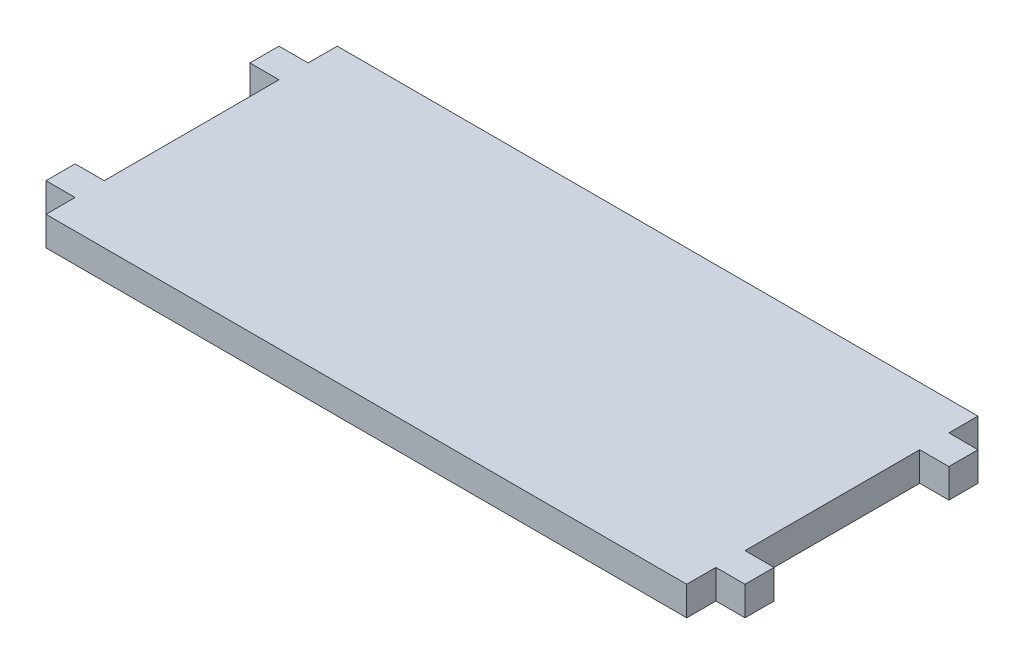
ISO-10303-21;
HEADER;
FILE_DESCRIPTION(('STEP AP214'),'2;1');
FILE_NAME('part.step','',(''),(''),'','','');
FILE_SCHEMA(('AUTOMOTIVE_DESIGN { 1 0 10303 214 1 1 1 1 }'));
ENDSEC;
DATA;
#1=APPLICATION_CONTEXT('core data for automotive mechanical design processes');
#2=APPLICATION_PROTOCOL_DEFINITION('international standard','automotive_design',2000,#1);
#3=PRODUCT_CONTEXT('',#1,'mechanical');
#4=PRODUCT('Part','Part','',(#3));
#5=PRODUCT_RELATED_PRODUCT_CATEGORY('part','',(#4));
#6=PRODUCT_DEFINITION_FORMATION('','',#4);
#7=PRODUCT_DEFINITION_CONTEXT('part definition',#1,'design');
#8=PRODUCT_DEFINITION('design','',#6,#7);
#9=PRODUCT_DEFINITION_SHAPE('','',#8);
#10=(LENGTH_UNIT() NAMED_UNIT(*) SI_UNIT(.MILLI.,.METRE.));
#11=(NAMED_UNIT(*) PLANE_ANGLE_UNIT() SI_UNIT($,.RADIAN.));
#12=(NAMED_UNIT(*) SI_UNIT($,.STERADIAN.) SOLID_ANGLE_UNIT());
#13=UNCERTAINTY_MEASURE_WITH_UNIT(LENGTH_MEASURE(1.E-05),#10,'distance_accuracy_value','');
#14=(GEOMETRIC_REPRESENTATION_CONTEXT(3) GLOBAL_UNCERTAINTY_ASSIGNED_CONTEXT((#13)) GLOBAL_UNIT_ASSIGNED_CONTEXT((#10,
#11,#12)) REPRESENTATION_CONTEXT('',''));
#15=CARTESIAN_POINT('',(0.,0.,0.));
#16=DIRECTION('',(0.,0.,1.));
#17=DIRECTION('',(1.,0.,0.));
#18=AXIS2_PLACEMENT_3D('',#15,#16,#17);
#19=CARTESIAN_POINT('',(18.0579399141631,5.,-43.524678111588));
#20=DIRECTION('',(-1.,0.,0.));
#21=DIRECTION('',(0.,0.,1.));
#22=AXIS2_PLACEMENT_3D('',#19,#20,#21);
#23=PLANE('',#22);
#24=DIRECTION('',(0.,1.,0.));
#25=VECTOR('',#24,1.);
#26=CARTESIAN_POINT('',(18.0579399141631,5.,-3.52467811158796));
#27=LINE('',#26,#25);
#28=CARTESIAN_POINT('',(18.0579399141631,0.,-3.52467811158796));
#29=VERTEX_POINT('',#28);
#30=CARTESIAN_POINT('',(18.0579399141631,5.,-3.52467811158796));
#31=VERTEX_POINT('',#30);
#32=EDGE_CURVE('E193',#29,#31,#27,.T.);
#33=ORIENTED_EDGE('',*,*,#32,.F.);
#34=DIRECTION('',(0.,0.,-1.));
#35=VECTOR('',#34,1.);
#36=CARTESIAN_POINT('',(18.0579399141631,0.,-43.524678111588));
#37=LINE('',#36,#35);
#38=CARTESIAN_POINT('',(18.0579399141631,0.,-33.524678111588));
#39=VERTEX_POINT('',#38);
#40=EDGE_CURVE('E297',#29,#39,#37,.T.);
#41=ORIENTED_EDGE('',*,*,#40,.T.);
#42=DIRECTION('',(0.,-1.,0.));
#43=VECTOR('',#42,1.);
#44=CARTESIAN_POINT('',(18.0579399141631,5.,-33.524678111588));
#45=LINE('',#44,#43);
#46=CARTESIAN_POINT('',(18.0579399141631,5.,-33.524678111588));
#47=VERTEX_POINT('',#46);
#48=EDGE_CURVE('E197',#47,#39,#45,.T.);
#49=ORIENTED_EDGE('',*,*,#48,.F.);
#50=DIRECTION('',(0.,0.,-1.));
#51=VECTOR('',#50,1.);
#52=CARTESIAN_POINT('',(18.0579399141631,5.,-43.524678111588));
#53=LINE('',#52,#51);
#54=EDGE_CURVE('E48',#31,#47,#53,.T.);
#55=ORIENTED_EDGE('',*,*,#54,.F.);
#56=EDGE_LOOP('',(#33,#41,#49,#55));
#57=FACE_BOUND('',#56,.T.);
#58=ADVANCED_FACE('F33',(#57),#23,.F.);
#59=DIRECTION('',(0.,-1.,0.));
#60=VECTOR('',#59,1.);
#61=CARTESIAN_POINT('',(18.0579399141631,5.,1.47532188841204));
#62=LINE('',#61,#60);
#63=CARTESIAN_POINT('',(18.0579399141631,5.,1.47532188841204));
#64=VERTEX_POINT('',#63);
#65=CARTESIAN_POINT('',(18.0579399141631,0.,1.47532188841204));
#66=VERTEX_POINT('',#65);
#67=EDGE_CURVE('E56',#64,#66,#62,.T.);
#68=ORIENTED_EDGE('',*,*,#67,.F.);
#69=CARTESIAN_POINT('',(18.0579399141631,5.,6.47532188841204));
#70=VERTEX_POINT('',#69);
#71=EDGE_CURVE('E281',#70,#64,#53,.T.);
#72=ORIENTED_EDGE('',*,*,#71,.F.);
#73=DIRECTION('',(0.,-1.,0.));
#74=VECTOR('',#73,1.);
#75=CARTESIAN_POINT('',(18.0579399141631,5.,6.47532188841204));
#76=LINE('',#75,#74);
#77=CARTESIAN_POINT('',(18.0579399141631,0.,6.47532188841204));
#78=VERTEX_POINT('',#77);
#79=EDGE_CURVE('E293',#70,#78,#76,.T.);
#80=ORIENTED_EDGE('',*,*,#79,.T.);
#81=EDGE_CURVE('E294',#78,#66,#37,.T.);
#82=ORIENTED_EDGE('',*,*,#81,.T.);
#83=EDGE_LOOP('',(#68,#72,#80,#82));
#84=FACE_BOUND('',#83,.T.);
#85=ADVANCED_FACE('F357',(#84),#23,.F.);
#86=DIRECTION('',(0.,1.,0.));
#87=VECTOR('',#86,1.);
#88=CARTESIAN_POINT('',(18.0579399141631,5.,-38.524678111588));
#89=LINE('',#88,#87);
#90=CARTESIAN_POINT('',(18.0579399141631,0.,-38.524678111588));
#91=VERTEX_POINT('',#90);
#92=CARTESIAN_POINT('',(18.0579399141631,5.,-38.524678111588));
#93=VERTEX_POINT('',#92);
#94=EDGE_CURVE('E194',#91,#93,#89,.T.);
#95=ORIENTED_EDGE('',*,*,#94,.F.);
#96=CARTESIAN_POINT('',(18.0579399141631,0.,-43.524678111588));
#97=VERTEX_POINT('',#96);
#98=EDGE_CURVE('E280',#91,#97,#37,.T.);
#99=ORIENTED_EDGE('',*,*,#98,.T.);
#100=DIRECTION('',(0.,-1.,0.));
#101=VECTOR('',#100,1.);
#102=CARTESIAN_POINT('',(18.0579399141631,5.,-43.524678111588));
#103=LINE('',#102,#101);
#104=CARTESIAN_POINT('',(18.0579399141631,5.,-43.524678111588));
#105=VERTEX_POINT('',#104);
#106=EDGE_CURVE('E11',#105,#97,#103,.T.);
#107=ORIENTED_EDGE('',*,*,#106,.F.);
#108=EDGE_CURVE('E284',#93,#105,#53,.T.);
#109=ORIENTED_EDGE('',*,*,#108,.F.);
#110=EDGE_LOOP('',(#95,#99,#107,#109));
#111=FACE_BOUND('',#110,.T.);
#112=ADVANCED_FACE('F35',(#111),#23,.F.);
#113=CARTESIAN_POINT('',(-91.9420600858369,5.,-43.524678111588));
#114=DIRECTION('',(1.,0.,0.));
#115=DIRECTION('',(0.,0.,-1.));
#116=AXIS2_PLACEMENT_3D('',#113,#114,#115);
#117=PLANE('',#116);
#118=DIRECTION('',(0.,-1.,0.));
#119=VECTOR('',#118,1.);
#120=CARTESIAN_POINT('',(-91.9420600858369,0.,-3.52467811158796));
#121=LINE('',#120,#119);
#122=CARTESIAN_POINT('',(-91.9420600858369,5.,-3.52467811158796));
#123=VERTEX_POINT('',#122);
#124=CARTESIAN_POINT('',(-91.9420600858369,0.,-3.52467811158796));
#125=VERTEX_POINT('',#124);
#126=EDGE_CURVE('E226',#123,#125,#121,.T.);
#127=ORIENTED_EDGE('',*,*,#126,.F.);
#128=DIRECTION('',(0.,0.,1.));
#129=VECTOR('',#128,1.);
#130=CARTESIAN_POINT('',(-91.9420600858369,5.,-43.524678111588));
#131=LINE('',#130,#129);
#132=CARTESIAN_POINT('',(-91.9420600858369,5.,-33.524678111588));
#133=VERTEX_POINT('',#132);
#134=EDGE_CURVE('E291',#133,#123,#131,.T.);
#135=ORIENTED_EDGE('',*,*,#134,.F.);
#136=DIRECTION('',(0.,1.,0.));
#137=VECTOR('',#136,1.);
#138=CARTESIAN_POINT('',(-91.9420600858369,0.,-33.524678111588));
#139=LINE('',#138,#137);
#140=CARTESIAN_POINT('',(-91.9420600858369,0.,-33.524678111588));
#141=VERTEX_POINT('',#140);
#142=EDGE_CURVE('E253',#141,#133,#139,.T.);
#143=ORIENTED_EDGE('',*,*,#142,.F.);
#144=DIRECTION('',(0.,0.,1.));
#145=VECTOR('',#144,1.);
#146=CARTESIAN_POINT('',(-91.9420600858369,0.,-43.524678111588));
#147=LINE('',#146,#145);
#148=EDGE_CURVE('E303',#141,#125,#147,.T.);
#149=ORIENTED_EDGE('',*,*,#148,.T.);
#150=EDGE_LOOP('',(#127,#135,#143,#149));
#151=FACE_BOUND('',#150,.T.);
#152=ADVANCED_FACE('F362',(#151),#117,.F.);
#153=DIRECTION('',(0.,1.,0.));
#154=VECTOR('',#153,1.);
#155=CARTESIAN_POINT('',(-91.9420600858369,0.,1.47532188841204));
#156=LINE('',#155,#154);
#157=CARTESIAN_POINT('',(-91.9420600858369,0.,1.47532188841204));
#158=VERTEX_POINT('',#157);
#159=CARTESIAN_POINT('',(-91.9420600858369,5.,1.47532188841204));
#160=VERTEX_POINT('',#159);
#161=EDGE_CURVE('E231',#158,#160,#156,.T.);
#162=ORIENTED_EDGE('',*,*,#161,.F.);
#163=CARTESIAN_POINT('',(-91.9420600858369,0.,6.47532188841204));
#164=VERTEX_POINT('',#163);
#165=EDGE_CURVE('E299',#158,#164,#147,.T.);
#166=ORIENTED_EDGE('',*,*,#165,.T.);
#167=DIRECTION('',(0.,-1.,0.));
#168=VECTOR('',#167,1.);
#169=CARTESIAN_POINT('',(-91.9420600858369,5.,6.47532188841204));
#170=LINE('',#169,#168);
#171=CARTESIAN_POINT('',(-91.9420600858369,5.,6.47532188841204));
#172=VERTEX_POINT('',#171);
#173=EDGE_CURVE('E307',#172,#164,#170,.T.);
#174=ORIENTED_EDGE('',*,*,#173,.F.);
#175=EDGE_CURVE('E286',#160,#172,#131,.T.);
#176=ORIENTED_EDGE('',*,*,#175,.F.);
#177=EDGE_LOOP('',(#162,#166,#174,#176));
#178=FACE_BOUND('',#177,.T.);
#179=ADVANCED_FACE('F366',(#178),#117,.F.);
#180=DIRECTION('',(0.,-1.,0.));
#181=VECTOR('',#180,1.);
#182=CARTESIAN_POINT('',(-91.9420600858369,0.,-38.524678111588));
#183=LINE('',#182,#181);
#184=CARTESIAN_POINT('',(-91.9420600858369,5.,-38.524678111588));
#185=VERTEX_POINT('',#184);
#186=CARTESIAN_POINT('',(-91.9420600858369,0.,-38.524678111588));
#187=VERTEX_POINT('',#186);
#188=EDGE_CURVE('E258',#185,#187,#183,.T.);
#189=ORIENTED_EDGE('',*,*,#188,.F.);
#190=CARTESIAN_POINT('',(-91.9420600858369,5.,-43.524678111588));
#191=VERTEX_POINT('',#190);
#192=EDGE_CURVE('E287',#191,#185,#131,.T.);
#193=ORIENTED_EDGE('',*,*,#192,.F.);
#194=DIRECTION('',(0.,-1.,0.));
#195=VECTOR('',#194,1.);
#196=CARTESIAN_POINT('',(-91.9420600858369,5.,-43.524678111588));
#197=LINE('',#196,#195);
#198=CARTESIAN_POINT('',(-91.9420600858369,0.,-43.524678111588));
#199=VERTEX_POINT('',#198);
#200=EDGE_CURVE('E41',#191,#199,#197,.T.);
#201=ORIENTED_EDGE('',*,*,#200,.T.);
#202=EDGE_CURVE('E300',#199,#187,#147,.T.);
#203=ORIENTED_EDGE('',*,*,#202,.T.);
#204=EDGE_LOOP('',(#189,#193,#201,#203));
#205=FACE_BOUND('',#204,.T.);
#206=ADVANCED_FACE('F314',(#205),#117,.F.);
#207=CARTESIAN_POINT('',(-91.9420600858369,5.,-43.524678111588));
#208=DIRECTION('',(0.,0.,1.));
#209=DIRECTION('',(1.,0.,0.));
#210=AXIS2_PLACEMENT_3D('',#207,#208,#209);
#211=PLANE('',#210);
#212=DIRECTION('',(-1.,0.,0.));
#213=VECTOR('',#212,1.);
#214=CARTESIAN_POINT('',(-91.9420600858369,0.,-43.524678111588));
#215=LINE('',#214,#213);
#216=EDGE_CURVE('E296',#97,#199,#215,.T.);
#217=ORIENTED_EDGE('',*,*,#216,.T.);
#218=ORIENTED_EDGE('',*,*,#200,.F.);
#219=DIRECTION('',(-1.,0.,0.));
#220=VECTOR('',#219,1.);
#221=CARTESIAN_POINT('',(-91.9420600858369,5.,-43.524678111588));
#222=LINE('',#221,#220);
#223=EDGE_CURVE('E283',#105,#191,#222,.T.);
#224=ORIENTED_EDGE('',*,*,#223,.F.);
#225=ORIENTED_EDGE('',*,*,#106,.T.);
#226=EDGE_LOOP('',(#217,#218,#224,#225));
#227=FACE_BOUND('',#226,.T.);
#228=ADVANCED_FACE('F330',(#227),#211,.F.);
#229=CARTESIAN_POINT('',(-91.9420600858369,5.,6.47532188841204));
#230=DIRECTION('',(0.,0.,-1.));
#231=DIRECTION('',(-1.,0.,0.));
#232=AXIS2_PLACEMENT_3D('',#229,#230,#231);
#233=PLANE('',#232);
#234=DIRECTION('',(1.,0.,0.));
#235=VECTOR('',#234,1.);
#236=CARTESIAN_POINT('',(-91.9420600858369,0.,6.47532188841204));
#237=LINE('',#236,#235);
#238=EDGE_CURVE('E302',#164,#78,#237,.T.);
#239=ORIENTED_EDGE('',*,*,#238,.T.);
#240=ORIENTED_EDGE('',*,*,#79,.F.);
#241=DIRECTION('',(1.,0.,0.));
#242=VECTOR('',#241,1.);
#243=CARTESIAN_POINT('',(-91.9420600858369,5.,6.47532188841204));
#244=LINE('',#243,#242);
#245=EDGE_CURVE('E290',#172,#70,#244,.T.);
#246=ORIENTED_EDGE('',*,*,#245,.F.);
#247=ORIENTED_EDGE('',*,*,#173,.T.);
#248=EDGE_LOOP('',(#239,#240,#246,#247));
#249=FACE_BOUND('',#248,.T.);
#250=ADVANCED_FACE('F378',(#249),#233,.F.);
#251=CARTESIAN_POINT('',(0.,5.,0.));
#252=DIRECTION('',(0.,1.,0.));
#253=DIRECTION('',(0.,0.,1.));
#254=AXIS2_PLACEMENT_3D('',#251,#252,#253);
#255=PLANE('',#254);
#256=ORIENTED_EDGE('',*,*,#71,.T.);
#257=DIRECTION('',(-1.,0.,0.));
#258=VECTOR('',#257,1.);
#259=CARTESIAN_POINT('',(23.0579399141631,5.,1.47532188841204));
#260=LINE('',#259,#258);
#261=CARTESIAN_POINT('',(23.0579399141631,5.,1.47532188841204));
#262=VERTEX_POINT('',#261);
#263=EDGE_CURVE('E178',#262,#64,#260,.T.);
#264=ORIENTED_EDGE('',*,*,#263,.F.);
#265=DIRECTION('',(0.,0.,1.));
#266=VECTOR('',#265,1.);
#267=CARTESIAN_POINT('',(23.0579399141631,5.,-3.52467811158796));
#268=LINE('',#267,#266);
#269=CARTESIAN_POINT('',(23.0579399141631,5.,-3.52467811158796));
#270=VERTEX_POINT('',#269);
#271=EDGE_CURVE('E171',#270,#262,#268,.T.);
#272=ORIENTED_EDGE('',*,*,#271,.F.);
#273=DIRECTION('',(-1.,0.,0.));
#274=VECTOR('',#273,1.);
#275=CARTESIAN_POINT('',(23.0579399141631,5.,-3.52467811158796));
#276=LINE('',#275,#274);
#277=EDGE_CURVE('E175',#270,#31,#276,.T.);
#278=ORIENTED_EDGE('',*,*,#277,.T.);
#279=ORIENTED_EDGE('',*,*,#54,.T.);
#280=DIRECTION('',(-1.,0.,0.));
#281=VECTOR('',#280,1.);
#282=CARTESIAN_POINT('',(23.0579399141631,5.,-33.524678111588));
#283=LINE('',#282,#281);
#284=CARTESIAN_POINT('',(23.0579399141631,5.,-33.524678111588));
#285=VERTEX_POINT('',#284);
#286=EDGE_CURVE('E220',#285,#47,#283,.T.);
#287=ORIENTED_EDGE('',*,*,#286,.F.);
#288=DIRECTION('',(0.,0.,1.));
#289=VECTOR('',#288,1.);
#290=CARTESIAN_POINT('',(23.0579399141631,5.,-38.524678111588));
#291=LINE('',#290,#289);
#292=CARTESIAN_POINT('',(23.0579399141631,5.,-38.524678111588));
#293=VERTEX_POINT('',#292);
#294=EDGE_CURVE('E206',#293,#285,#291,.T.);
#295=ORIENTED_EDGE('',*,*,#294,.F.);
#296=DIRECTION('',(-1.,0.,0.));
#297=VECTOR('',#296,1.);
#298=CARTESIAN_POINT('',(23.0579399141631,5.,-38.524678111588));
#299=LINE('',#298,#297);
#300=EDGE_CURVE('E223',#293,#93,#299,.T.);
#301=ORIENTED_EDGE('',*,*,#300,.T.);
#302=ORIENTED_EDGE('',*,*,#108,.T.);
#303=ORIENTED_EDGE('',*,*,#223,.T.);
#304=ORIENTED_EDGE('',*,*,#192,.T.);
#305=DIRECTION('',(1.,0.,0.));
#306=VECTOR('',#305,1.);
#307=CARTESIAN_POINT('',(-96.9420600858369,5.,-38.524678111588));
#308=LINE('',#307,#306);
#309=CARTESIAN_POINT('',(-96.9420600858369,5.,-38.524678111588));
#310=VERTEX_POINT('',#309);
#311=EDGE_CURVE('E274',#310,#185,#308,.T.);
#312=ORIENTED_EDGE('',*,*,#311,.F.);
#313=DIRECTION('',(0.,0.,-1.));
#314=VECTOR('',#313,1.);
#315=CARTESIAN_POINT('',(-96.9420600858369,5.,-38.524678111588));
#316=LINE('',#315,#314);
#317=CARTESIAN_POINT('',(-96.9420600858369,5.,-33.524678111588));
#318=VERTEX_POINT('',#317);
#319=EDGE_CURVE('E257',#318,#310,#316,.T.);
#320=ORIENTED_EDGE('',*,*,#319,.F.);
#321=DIRECTION('',(1.,0.,0.));
#322=VECTOR('',#321,1.);
#323=CARTESIAN_POINT('',(-96.9420600858369,5.,-33.524678111588));
#324=LINE('',#323,#322);
#325=EDGE_CURVE('E277',#318,#133,#324,.T.);
#326=ORIENTED_EDGE('',*,*,#325,.T.);
#327=ORIENTED_EDGE('',*,*,#134,.T.);
#328=DIRECTION('',(1.,0.,0.));
#329=VECTOR('',#328,1.);
#330=CARTESIAN_POINT('',(-96.9420600858369,5.,-3.52467811158796));
#331=LINE('',#330,#329);
#332=CARTESIAN_POINT('',(-96.9420600858369,5.,-3.52467811158796));
#333=VERTEX_POINT('',#332);
#334=EDGE_CURVE('E237',#333,#123,#331,.T.);
#335=ORIENTED_EDGE('',*,*,#334,.F.);
#336=DIRECTION('',(0.,0.,-1.));
#337=VECTOR('',#336,1.);
#338=CARTESIAN_POINT('',(-96.9420600858369,5.,1.47532188841204));
#339=LINE('',#338,#337);
#340=CARTESIAN_POINT('',(-96.9420600858369,5.,1.47532188841204));
#341=VERTEX_POINT('',#340);
#342=EDGE_CURVE('E235',#341,#333,#339,.T.);
#343=ORIENTED_EDGE('',*,*,#342,.F.);
#344=DIRECTION('',(1.,0.,0.));
#345=VECTOR('',#344,1.);
#346=CARTESIAN_POINT('',(-96.9420600858369,5.,1.47532188841204));
#347=LINE('',#346,#345);
#348=EDGE_CURVE('E244',#341,#160,#347,.T.);
#349=ORIENTED_EDGE('',*,*,#348,.T.);
#350=ORIENTED_EDGE('',*,*,#175,.T.);
#351=ORIENTED_EDGE('',*,*,#245,.T.);
#352=EDGE_LOOP('',(#256,#264,#272,#278,#279,#287,#295,#301,#302,#303,#304,#312,#320,#326,#327,
#335,#343,#349,#350,#351));
#353=FACE_BOUND('',#352,.T.);
#354=ADVANCED_FACE('F173',(#353),#255,.T.);
#355=CARTESIAN_POINT('',(0.,0.,0.));
#356=DIRECTION('',(0.,1.,0.));
#357=DIRECTION('',(0.,0.,1.));
#358=AXIS2_PLACEMENT_3D('',#355,#356,#357);
#359=PLANE('',#358);
#360=ORIENTED_EDGE('',*,*,#81,.F.);
#361=ORIENTED_EDGE('',*,*,#238,.F.);
#362=ORIENTED_EDGE('',*,*,#165,.F.);
#363=DIRECTION('',(1.,0.,0.));
#364=VECTOR('',#363,1.);
#365=CARTESIAN_POINT('',(-96.9420600858369,0.,1.47532188841204));
#366=LINE('',#365,#364);
#367=CARTESIAN_POINT('',(-96.9420600858369,0.,1.47532188841204));
#368=VERTEX_POINT('',#367);
#369=EDGE_CURVE('E247',#368,#158,#366,.T.);
#370=ORIENTED_EDGE('',*,*,#369,.F.);
#371=DIRECTION('',(0.,0.,1.));
#372=VECTOR('',#371,1.);
#373=CARTESIAN_POINT('',(-96.9420600858369,0.,1.47532188841204));
#374=LINE('',#373,#372);
#375=CARTESIAN_POINT('',(-96.9420600858369,0.,-3.52467811158796));
#376=VERTEX_POINT('',#375);
#377=EDGE_CURVE('E230',#376,#368,#374,.T.);
#378=ORIENTED_EDGE('',*,*,#377,.F.);
#379=DIRECTION('',(1.,0.,0.));
#380=VECTOR('',#379,1.);
#381=CARTESIAN_POINT('',(-96.9420600858369,0.,-3.52467811158796));
#382=LINE('',#381,#380);
#383=EDGE_CURVE('E250',#376,#125,#382,.T.);
#384=ORIENTED_EDGE('',*,*,#383,.T.);
#385=ORIENTED_EDGE('',*,*,#148,.F.);
#386=DIRECTION('',(1.,0.,0.));
#387=VECTOR('',#386,1.);
#388=CARTESIAN_POINT('',(-96.9420600858369,0.,-33.524678111588));
#389=LINE('',#388,#387);
#390=CARTESIAN_POINT('',(-96.9420600858369,0.,-33.524678111588));
#391=VERTEX_POINT('',#390);
#392=EDGE_CURVE('E264',#391,#141,#389,.T.);
#393=ORIENTED_EDGE('',*,*,#392,.F.);
#394=DIRECTION('',(0.,0.,1.));
#395=VECTOR('',#394,1.);
#396=CARTESIAN_POINT('',(-96.9420600858369,0.,-38.524678111588));
#397=LINE('',#396,#395);
#398=CARTESIAN_POINT('',(-96.9420600858369,0.,-38.524678111588));
#399=VERTEX_POINT('',#398);
#400=EDGE_CURVE('E262',#399,#391,#397,.T.);
#401=ORIENTED_EDGE('',*,*,#400,.F.);
#402=DIRECTION('',(1.,0.,0.));
#403=VECTOR('',#402,1.);
#404=CARTESIAN_POINT('',(-96.9420600858369,0.,-38.524678111588));
#405=LINE('',#404,#403);
#406=EDGE_CURVE('E271',#399,#187,#405,.T.);
#407=ORIENTED_EDGE('',*,*,#406,.T.);
#408=ORIENTED_EDGE('',*,*,#202,.F.);
#409=ORIENTED_EDGE('',*,*,#216,.F.);
#410=ORIENTED_EDGE('',*,*,#98,.F.);
#411=DIRECTION('',(-1.,0.,0.));
#412=VECTOR('',#411,1.);
#413=CARTESIAN_POINT('',(23.0579399141631,0.,-38.524678111588));
#414=LINE('',#413,#412);
#415=CARTESIAN_POINT('',(23.0579399141631,0.,-38.524678111588));
#416=VERTEX_POINT('',#415);
#417=EDGE_CURVE('E211',#416,#91,#414,.T.);
#418=ORIENTED_EDGE('',*,*,#417,.F.);
#419=DIRECTION('',(0.,0.,-1.));
#420=VECTOR('',#419,1.);
#421=CARTESIAN_POINT('',(23.0579399141631,0.,-38.524678111588));
#422=LINE('',#421,#420);
#423=CARTESIAN_POINT('',(23.0579399141631,0.,-33.524678111588));
#424=VERTEX_POINT('',#423);
#425=EDGE_CURVE('E210',#424,#416,#422,.T.);
#426=ORIENTED_EDGE('',*,*,#425,.F.);
#427=DIRECTION('',(-1.,0.,0.));
#428=VECTOR('',#427,1.);
#429=CARTESIAN_POINT('',(23.0579399141631,0.,-33.524678111588));
#430=LINE('',#429,#428);
#431=EDGE_CURVE('E217',#424,#39,#430,.T.);
#432=ORIENTED_EDGE('',*,*,#431,.T.);
#433=ORIENTED_EDGE('',*,*,#40,.F.);
#434=DIRECTION('',(-1.,0.,0.));
#435=VECTOR('',#434,1.);
#436=CARTESIAN_POINT('',(23.0579399141631,0.,-3.52467811158796));
#437=LINE('',#436,#435);
#438=CARTESIAN_POINT('',(23.0579399141631,0.,-3.52467811158796));
#439=VERTEX_POINT('',#438);
#440=EDGE_CURVE('E429',#439,#29,#437,.T.);
#441=ORIENTED_EDGE('',*,*,#440,.F.);
#442=DIRECTION('',(0.,0.,-1.));
#443=VECTOR('',#442,1.);
#444=CARTESIAN_POINT('',(23.0579399141631,0.,-3.52467811158796));
#445=LINE('',#444,#443);
#446=CARTESIAN_POINT('',(23.0579399141631,0.,1.47532188841204));
#447=VERTEX_POINT('',#446);
#448=EDGE_CURVE('E187',#447,#439,#445,.T.);
#449=ORIENTED_EDGE('',*,*,#448,.F.);
#450=DIRECTION('',(-1.,0.,0.));
#451=VECTOR('',#450,1.);
#452=CARTESIAN_POINT('',(23.0579399141631,0.,1.47532188841204));
#453=LINE('',#452,#451);
#454=EDGE_CURVE('E199',#447,#66,#453,.T.);
#455=ORIENTED_EDGE('',*,*,#454,.T.);
#456=EDGE_LOOP('',(#360,#361,#362,#370,#378,#384,#385,#393,#401,#407,#408,#409,#410,#418,#426,
#432,#433,#441,#449,#455));
#457=FACE_BOUND('',#456,.T.);
#458=ADVANCED_FACE('F320',(#457),#359,.F.);
#459=CARTESIAN_POINT('',(-96.9420600858369,0.,-33.524678111588));
#460=DIRECTION('',(0.,0.,-1.));
#461=DIRECTION('',(0.,1.,0.));
#462=AXIS2_PLACEMENT_3D('',#459,#460,#461);
#463=PLANE('',#462);
#464=ORIENTED_EDGE('',*,*,#142,.T.);
#465=ORIENTED_EDGE('',*,*,#325,.F.);
#466=DIRECTION('',(0.,1.,0.));
#467=VECTOR('',#466,1.);
#468=CARTESIAN_POINT('',(-96.9420600858369,0.,-33.524678111588));
#469=LINE('',#468,#467);
#470=EDGE_CURVE('E254',#391,#318,#469,.T.);
#471=ORIENTED_EDGE('',*,*,#470,.F.);
#472=ORIENTED_EDGE('',*,*,#392,.T.);
#473=EDGE_LOOP('',(#464,#465,#471,#472));
#474=FACE_BOUND('',#473,.T.);
#475=ADVANCED_FACE('F389',(#474),#463,.F.);
#476=CARTESIAN_POINT('',(-96.9420600858369,0.,-38.524678111588));
#477=DIRECTION('',(0.,0.,1.));
#478=DIRECTION('',(1.,0.,0.));
#479=AXIS2_PLACEMENT_3D('',#476,#477,#478);
#480=PLANE('',#479);
#481=ORIENTED_EDGE('',*,*,#188,.T.);
#482=ORIENTED_EDGE('',*,*,#406,.F.);
#483=DIRECTION('',(0.,-1.,0.));
#484=VECTOR('',#483,1.);
#485=CARTESIAN_POINT('',(-96.9420600858369,0.,-38.524678111588));
#486=LINE('',#485,#484);
#487=EDGE_CURVE('E260',#310,#399,#486,.T.);
#488=ORIENTED_EDGE('',*,*,#487,.F.);
#489=ORIENTED_EDGE('',*,*,#311,.T.);
#490=EDGE_LOOP('',(#481,#482,#488,#489));
#491=FACE_BOUND('',#490,.T.);
#492=ADVANCED_FACE('F327',(#491),#480,.F.);
#493=CARTESIAN_POINT('',(-96.9420600858369,0.,0.));
#494=DIRECTION('',(1.,0.,0.));
#495=DIRECTION('',(0.,0.,-1.));
#496=AXIS2_PLACEMENT_3D('',#493,#494,#495);
#497=PLANE('',#496);
#498=ORIENTED_EDGE('',*,*,#470,.T.);
#499=ORIENTED_EDGE('',*,*,#319,.T.);
#500=ORIENTED_EDGE('',*,*,#487,.T.);
#501=ORIENTED_EDGE('',*,*,#400,.T.);
#502=EDGE_LOOP('',(#498,#499,#500,#501));
#503=FACE_BOUND('',#502,.T.);
#504=ADVANCED_FACE('F396',(#503),#497,.F.);
#505=CARTESIAN_POINT('',(-96.9420600858369,0.,-3.52467811158796));
#506=DIRECTION('',(0.,0.,1.));
#507=DIRECTION('',(0.,-1.,0.));
#508=AXIS2_PLACEMENT_3D('',#505,#506,#507);
#509=PLANE('',#508);
#510=ORIENTED_EDGE('',*,*,#126,.T.);
#511=ORIENTED_EDGE('',*,*,#383,.F.);
#512=DIRECTION('',(0.,-1.,0.));
#513=VECTOR('',#512,1.);
#514=CARTESIAN_POINT('',(-96.9420600858369,0.,-3.52467811158796));
#515=LINE('',#514,#513);
#516=EDGE_CURVE('E227',#333,#376,#515,.T.);
#517=ORIENTED_EDGE('',*,*,#516,.F.);
#518=ORIENTED_EDGE('',*,*,#334,.T.);
#519=EDGE_LOOP('',(#510,#511,#517,#518));
#520=FACE_BOUND('',#519,.T.);
#521=ADVANCED_FACE('F399',(#520),#509,.F.);
#522=CARTESIAN_POINT('',(-96.9420600858369,0.,1.47532188841204));
#523=DIRECTION('',(0.,0.,-1.));
#524=DIRECTION('',(-1.,0.,0.));
#525=AXIS2_PLACEMENT_3D('',#522,#523,#524);
#526=PLANE('',#525);
#527=ORIENTED_EDGE('',*,*,#161,.T.);
#528=ORIENTED_EDGE('',*,*,#348,.F.);
#529=DIRECTION('',(0.,1.,0.));
#530=VECTOR('',#529,1.);
#531=CARTESIAN_POINT('',(-96.9420600858369,0.,1.47532188841204));
#532=LINE('',#531,#530);
#533=EDGE_CURVE('E233',#368,#341,#532,.T.);
#534=ORIENTED_EDGE('',*,*,#533,.F.);
#535=ORIENTED_EDGE('',*,*,#369,.T.);
#536=EDGE_LOOP('',(#527,#528,#534,#535));
#537=FACE_BOUND('',#536,.T.);
#538=ADVANCED_FACE('F353',(#537),#526,.F.);
#539=CARTESIAN_POINT('',(-96.9420600858369,0.,0.));
#540=DIRECTION('',(-1.,0.,0.));
#541=DIRECTION('',(0.,0.,1.));
#542=AXIS2_PLACEMENT_3D('',#539,#540,#541);
#543=PLANE('',#542);
#544=ORIENTED_EDGE('',*,*,#516,.T.);
#545=ORIENTED_EDGE('',*,*,#377,.T.);
#546=ORIENTED_EDGE('',*,*,#533,.T.);
#547=ORIENTED_EDGE('',*,*,#342,.T.);
#548=EDGE_LOOP('',(#544,#545,#546,#547));
#549=FACE_BOUND('',#548,.T.);
#550=ADVANCED_FACE('F346',(#549),#543,.T.);
#551=CARTESIAN_POINT('',(23.0579399141631,5.,-38.524678111588));
#552=DIRECTION('',(0.,0.,1.));
#553=DIRECTION('',(1.,0.,0.));
#554=AXIS2_PLACEMENT_3D('',#551,#552,#553);
#555=PLANE('',#554);
#556=ORIENTED_EDGE('',*,*,#94,.T.);
#557=ORIENTED_EDGE('',*,*,#300,.F.);
#558=DIRECTION('',(0.,1.,0.));
#559=VECTOR('',#558,1.);
#560=CARTESIAN_POINT('',(23.0579399141631,5.,-38.524678111588));
#561=LINE('',#560,#559);
#562=EDGE_CURVE('E203',#416,#293,#561,.T.);
#563=ORIENTED_EDGE('',*,*,#562,.F.);
#564=ORIENTED_EDGE('',*,*,#417,.T.);
#565=EDGE_LOOP('',(#556,#557,#563,#564));
#566=FACE_BOUND('',#565,.T.);
#567=ADVANCED_FACE('F344',(#566),#555,.F.);
#568=CARTESIAN_POINT('',(23.0579399141631,5.,-33.524678111588));
#569=DIRECTION('',(0.,0.,-1.));
#570=DIRECTION('',(-1.,0.,0.));
#571=AXIS2_PLACEMENT_3D('',#568,#569,#570);
#572=PLANE('',#571);
#573=ORIENTED_EDGE('',*,*,#48,.T.);
#574=ORIENTED_EDGE('',*,*,#431,.F.);
#575=DIRECTION('',(0.,-1.,0.));
#576=VECTOR('',#575,1.);
#577=CARTESIAN_POINT('',(23.0579399141631,5.,-33.524678111588));
#578=LINE('',#577,#576);
#579=EDGE_CURVE('E208',#285,#424,#578,.T.);
#580=ORIENTED_EDGE('',*,*,#579,.F.);
#581=ORIENTED_EDGE('',*,*,#286,.T.);
#582=EDGE_LOOP('',(#573,#574,#580,#581));
#583=FACE_BOUND('',#582,.T.);
#584=ADVANCED_FACE('F335',(#583),#572,.F.);
#585=CARTESIAN_POINT('',(23.0579399141631,0.,0.));
#586=DIRECTION('',(-1.,0.,0.));
#587=DIRECTION('',(0.,0.,1.));
#588=AXIS2_PLACEMENT_3D('',#585,#586,#587);
#589=PLANE('',#588);
#590=ORIENTED_EDGE('',*,*,#562,.T.);
#591=ORIENTED_EDGE('',*,*,#294,.T.);
#592=ORIENTED_EDGE('',*,*,#579,.T.);
#593=ORIENTED_EDGE('',*,*,#425,.T.);
#594=EDGE_LOOP('',(#590,#591,#592,#593));
#595=FACE_BOUND('',#594,.T.);
#596=ADVANCED_FACE('F341',(#595),#589,.F.);
#597=CARTESIAN_POINT('',(23.0579399141631,5.,-3.52467811158796));
#598=DIRECTION('',(0.,0.,1.));
#599=DIRECTION('',(0.,-1.,0.));
#600=AXIS2_PLACEMENT_3D('',#597,#598,#599);
#601=PLANE('',#600);
#602=ORIENTED_EDGE('',*,*,#32,.T.);
#603=ORIENTED_EDGE('',*,*,#277,.F.);
#604=DIRECTION('',(0.,1.,0.));
#605=VECTOR('',#604,1.);
#606=CARTESIAN_POINT('',(23.0579399141631,5.,-3.52467811158796));
#607=LINE('',#606,#605);
#608=EDGE_CURVE('E182',#439,#270,#607,.T.);
#609=ORIENTED_EDGE('',*,*,#608,.F.);
#610=ORIENTED_EDGE('',*,*,#440,.T.);
#611=EDGE_LOOP('',(#602,#603,#609,#610));
#612=FACE_BOUND('',#611,.T.);
#613=ADVANCED_FACE('F192',(#612),#601,.F.);
#614=CARTESIAN_POINT('',(23.0579399141631,5.,1.47532188841204));
#615=DIRECTION('',(0.,0.,-1.));
#616=DIRECTION('',(0.,1.,0.));
#617=AXIS2_PLACEMENT_3D('',#614,#615,#616);
#618=PLANE('',#617);
#619=ORIENTED_EDGE('',*,*,#67,.T.);
#620=ORIENTED_EDGE('',*,*,#454,.F.);
#621=DIRECTION('',(0.,-1.,0.));
#622=VECTOR('',#621,1.);
#623=CARTESIAN_POINT('',(23.0579399141631,5.,1.47532188841204));
#624=LINE('',#623,#622);
#625=EDGE_CURVE('E181',#262,#447,#624,.T.);
#626=ORIENTED_EDGE('',*,*,#625,.F.);
#627=ORIENTED_EDGE('',*,*,#263,.T.);
#628=EDGE_LOOP('',(#619,#620,#626,#627));
#629=FACE_BOUND('',#628,.T.);
#630=ADVANCED_FACE('F425',(#629),#618,.F.);
#631=CARTESIAN_POINT('',(23.0579399141631,0.,0.));
#632=DIRECTION('',(-1.,0.,0.));
#633=DIRECTION('',(0.,0.,1.));
#634=AXIS2_PLACEMENT_3D('',#631,#632,#633);
#635=PLANE('',#634);
#636=ORIENTED_EDGE('',*,*,#608,.T.);
#637=ORIENTED_EDGE('',*,*,#271,.T.);
#638=ORIENTED_EDGE('',*,*,#625,.T.);
#639=ORIENTED_EDGE('',*,*,#448,.T.);
#640=EDGE_LOOP('',(#636,#637,#638,#639));
#641=FACE_BOUND('',#640,.T.);
#642=ADVANCED_FACE('F185',(#641),#635,.F.);
#643=CLOSED_SHELL('',(#58,#85,#112,#152,#179,#206,#228,#250,#354,#458,#475,#492,#504,#521,#538,
#550,#567,#584,#596,#613,#630,#642));
#644=MANIFOLD_SOLID_BREP('B2',#643);
#645=ADVANCED_BREP_SHAPE_REPRESENTATION('',(#18,#644),#14);
#646=SHAPE_DEFINITION_REPRESENTATION(#9,#645);
ENDSEC;
END-ISO-10303-21;
